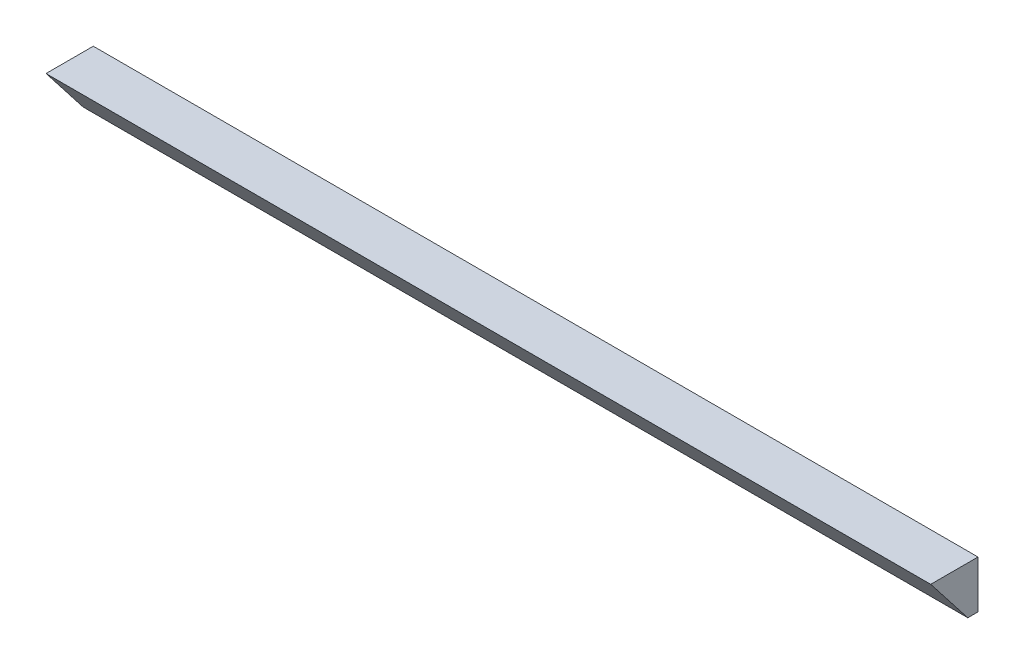
ISO-10303-21;
HEADER;
FILE_DESCRIPTION(('STEP AP214'),'2;1');
FILE_NAME('part.step','',(''),(''),'','','');
FILE_SCHEMA(('AUTOMOTIVE_DESIGN { 1 0 10303 214 1 1 1 1 }'));
ENDSEC;
DATA;
#1=APPLICATION_CONTEXT('core data for automotive mechanical design processes');
#2=APPLICATION_PROTOCOL_DEFINITION('international standard','automotive_design',2000,#1);
#3=PRODUCT_CONTEXT('',#1,'mechanical');
#4=PRODUCT('Part','Part','',(#3));
#5=PRODUCT_RELATED_PRODUCT_CATEGORY('part','',(#4));
#6=PRODUCT_DEFINITION_FORMATION('','',#4);
#7=PRODUCT_DEFINITION_CONTEXT('part definition',#1,'design');
#8=PRODUCT_DEFINITION('design','',#6,#7);
#9=PRODUCT_DEFINITION_SHAPE('','',#8);
#10=(LENGTH_UNIT() NAMED_UNIT(*) SI_UNIT(.MILLI.,.METRE.));
#11=(NAMED_UNIT(*) PLANE_ANGLE_UNIT() SI_UNIT($,.RADIAN.));
#12=(NAMED_UNIT(*) SI_UNIT($,.STERADIAN.) SOLID_ANGLE_UNIT());
#13=UNCERTAINTY_MEASURE_WITH_UNIT(LENGTH_MEASURE(1.E-05),#10,'distance_accuracy_value','');
#14=(GEOMETRIC_REPRESENTATION_CONTEXT(3) GLOBAL_UNCERTAINTY_ASSIGNED_CONTEXT((#13)) GLOBAL_UNIT_ASSIGNED_CONTEXT((#10,
#11,#12)) REPRESENTATION_CONTEXT('',''));
#15=CARTESIAN_POINT('',(0.,0.,0.));
#16=DIRECTION('',(0.,0.,1.));
#17=DIRECTION('',(1.,0.,0.));
#18=AXIS2_PLACEMENT_3D('',#15,#16,#17);
#19=CARTESIAN_POINT('',(-37.810925728328,-40.3644970414201,38.));
#20=DIRECTION('',(0.,1.,0.));
#21=DIRECTION('',(0.,0.,1.));
#22=AXIS2_PLACEMENT_3D('',#19,#20,#21);
#23=PLANE('',#22);
#24=DIRECTION('',(0.,0.,1.));
#25=VECTOR('',#24,1.);
#26=CARTESIAN_POINT('',(55.189074271672,-40.3644970414201,38.));
#27=LINE('',#26,#25);
#28=CARTESIAN_POINT('',(55.189074271672,-40.3644970414201,38.));
#29=VERTEX_POINT('',#28);
#30=CARTESIAN_POINT('',(55.189074271672,-40.3644970414201,39.0702920703453));
#31=VERTEX_POINT('',#30);
#32=EDGE_CURVE('E96',#29,#31,#27,.T.);
#33=ORIENTED_EDGE('',*,*,#32,.T.);
#34=DIRECTION('',(1.,0.,0.));
#35=VECTOR('',#34,1.);
#36=CARTESIAN_POINT('',(-37.810925728328,-40.3644970414201,39.0702920703453));
#37=LINE('',#36,#35);
#38=CARTESIAN_POINT('',(-37.810925728328,-40.3644970414201,39.0702920703453));
#39=VERTEX_POINT('',#38);
#40=EDGE_CURVE('E11',#39,#31,#37,.T.);
#41=ORIENTED_EDGE('',*,*,#40,.F.);
#42=DIRECTION('',(0.,0.,1.));
#43=VECTOR('',#42,1.);
#44=CARTESIAN_POINT('',(-37.810925728328,-40.3644970414201,38.));
#45=LINE('',#44,#43);
#46=CARTESIAN_POINT('',(-37.810925728328,-40.3644970414201,38.));
#47=VERTEX_POINT('',#46);
#48=EDGE_CURVE('E84',#47,#39,#45,.T.);
#49=ORIENTED_EDGE('',*,*,#48,.F.);
#50=DIRECTION('',(1.,0.,0.));
#51=VECTOR('',#50,1.);
#52=CARTESIAN_POINT('',(-37.810925728328,-40.3644970414201,38.));
#53=LINE('',#52,#51);
#54=EDGE_CURVE('E92',#47,#29,#53,.T.);
#55=ORIENTED_EDGE('',*,*,#54,.T.);
#56=EDGE_LOOP('',(#33,#41,#49,#55));
#57=FACE_BOUND('',#56,.T.);
#58=ADVANCED_FACE('F33',(#57),#23,.F.);
#59=CARTESIAN_POINT('',(-37.810925728328,-35.3644970414201,42.9711110868764));
#60=DIRECTION('',(0.,0.615112092088311,-0.788439670594232));
#61=DIRECTION('',(0.,0.788439670594232,0.615112092088311));
#62=AXIS2_PLACEMENT_3D('',#59,#60,#61);
#63=PLANE('',#62);
#64=DIRECTION('',(0.,0.788439670594232,0.615112092088311));
#65=VECTOR('',#64,1.);
#66=CARTESIAN_POINT('',(55.189074271672,-35.3644970414201,42.9711110868764));
#67=LINE('',#66,#65);
#68=CARTESIAN_POINT('',(55.189074271672,-35.3644970414201,42.9711110868764));
#69=VERTEX_POINT('',#68);
#70=EDGE_CURVE('E88',#31,#69,#67,.T.);
#71=ORIENTED_EDGE('',*,*,#70,.T.);
#72=DIRECTION('',(1.,0.,0.));
#73=VECTOR('',#72,1.);
#74=CARTESIAN_POINT('',(-37.810925728328,-35.3644970414201,42.9711110868764));
#75=LINE('',#74,#73);
#76=CARTESIAN_POINT('',(-37.810925728328,-35.3644970414201,42.9711110868764));
#77=VERTEX_POINT('',#76);
#78=EDGE_CURVE('E41',#77,#69,#75,.T.);
#79=ORIENTED_EDGE('',*,*,#78,.F.);
#80=DIRECTION('',(0.,0.788439670594232,0.615112092088311));
#81=VECTOR('',#80,1.);
#82=CARTESIAN_POINT('',(-37.810925728328,-35.3644970414201,42.9711110868764));
#83=LINE('',#82,#81);
#84=EDGE_CURVE('E79',#39,#77,#83,.T.);
#85=ORIENTED_EDGE('',*,*,#84,.F.);
#86=ORIENTED_EDGE('',*,*,#40,.T.);
#87=EDGE_LOOP('',(#71,#79,#85,#86));
#88=FACE_BOUND('',#87,.T.);
#89=ADVANCED_FACE('F87',(#88),#63,.F.);
#90=CARTESIAN_POINT('',(-37.810925728328,-35.3644970414201,38.));
#91=DIRECTION('',(0.,-1.,0.));
#92=DIRECTION('',(0.,0.,-1.));
#93=AXIS2_PLACEMENT_3D('',#90,#91,#92);
#94=PLANE('',#93);
#95=DIRECTION('',(0.,0.,-1.));
#96=VECTOR('',#95,1.);
#97=CARTESIAN_POINT('',(55.189074271672,-35.3644970414201,38.));
#98=LINE('',#97,#96);
#99=CARTESIAN_POINT('',(55.189074271672,-35.3644970414201,38.));
#100=VERTEX_POINT('',#99);
#101=EDGE_CURVE('E66',#69,#100,#98,.T.);
#102=ORIENTED_EDGE('',*,*,#101,.T.);
#103=DIRECTION('',(1.,0.,0.));
#104=VECTOR('',#103,1.);
#105=CARTESIAN_POINT('',(-37.810925728328,-35.3644970414201,38.));
#106=LINE('',#105,#104);
#107=CARTESIAN_POINT('',(-37.810925728328,-35.3644970414201,38.));
#108=VERTEX_POINT('',#107);
#109=EDGE_CURVE('E89',#108,#100,#106,.T.);
#110=ORIENTED_EDGE('',*,*,#109,.F.);
#111=DIRECTION('',(0.,0.,-1.));
#112=VECTOR('',#111,1.);
#113=CARTESIAN_POINT('',(-37.810925728328,-35.3644970414201,38.));
#114=LINE('',#113,#112);
#115=EDGE_CURVE('E82',#77,#108,#114,.T.);
#116=ORIENTED_EDGE('',*,*,#115,.F.);
#117=ORIENTED_EDGE('',*,*,#78,.T.);
#118=EDGE_LOOP('',(#102,#110,#116,#117));
#119=FACE_BOUND('',#118,.T.);
#120=ADVANCED_FACE('F90',(#119),#94,.F.);
#121=CARTESIAN_POINT('',(-37.810925728328,-40.3644970414201,38.));
#122=DIRECTION('',(0.,0.,1.));
#123=DIRECTION('',(0.,-1.,0.));
#124=AXIS2_PLACEMENT_3D('',#121,#122,#123);
#125=PLANE('',#124);
#126=DIRECTION('',(0.,-1.,0.));
#127=VECTOR('',#126,1.);
#128=CARTESIAN_POINT('',(55.189074271672,-40.3644970414201,38.));
#129=LINE('',#128,#127);
#130=EDGE_CURVE('E72',#100,#29,#129,.T.);
#131=ORIENTED_EDGE('',*,*,#130,.T.);
#132=ORIENTED_EDGE('',*,*,#54,.F.);
#133=DIRECTION('',(0.,-1.,0.));
#134=VECTOR('',#133,1.);
#135=CARTESIAN_POINT('',(-37.810925728328,-40.3644970414201,38.));
#136=LINE('',#135,#134);
#137=EDGE_CURVE('E49',#108,#47,#136,.T.);
#138=ORIENTED_EDGE('',*,*,#137,.F.);
#139=ORIENTED_EDGE('',*,*,#109,.T.);
#140=EDGE_LOOP('',(#131,#132,#138,#139));
#141=FACE_BOUND('',#140,.T.);
#142=ADVANCED_FACE('F103',(#141),#125,.F.);
#143=CARTESIAN_POINT('',(-37.810925728328,0.,0.));
#144=DIRECTION('',(-1.,0.,0.));
#145=DIRECTION('',(0.,0.,1.));
#146=AXIS2_PLACEMENT_3D('',#143,#144,#145);
#147=PLANE('',#146);
#148=ORIENTED_EDGE('',*,*,#48,.T.);
#149=ORIENTED_EDGE('',*,*,#84,.T.);
#150=ORIENTED_EDGE('',*,*,#115,.T.);
#151=ORIENTED_EDGE('',*,*,#137,.T.);
#152=EDGE_LOOP('',(#148,#149,#150,#151));
#153=FACE_BOUND('',#152,.T.);
#154=ADVANCED_FACE('F80',(#153),#147,.T.);
#155=CARTESIAN_POINT('',(55.189074271672,0.,0.));
#156=DIRECTION('',(-1.,0.,0.));
#157=DIRECTION('',(0.,0.,1.));
#158=AXIS2_PLACEMENT_3D('',#155,#156,#157);
#159=PLANE('',#158);
#160=ORIENTED_EDGE('',*,*,#32,.F.);
#161=ORIENTED_EDGE('',*,*,#130,.F.);
#162=ORIENTED_EDGE('',*,*,#101,.F.);
#163=ORIENTED_EDGE('',*,*,#70,.F.);
#164=EDGE_LOOP('',(#160,#161,#162,#163));
#165=FACE_BOUND('',#164,.T.);
#166=ADVANCED_FACE('F106',(#165),#159,.F.);
#167=CLOSED_SHELL('',(#58,#89,#120,#142,#154,#166));
#168=MANIFOLD_SOLID_BREP('B2',#167);
#169=ADVANCED_BREP_SHAPE_REPRESENTATION('',(#18,#168),#14);
#170=SHAPE_DEFINITION_REPRESENTATION(#9,#169);
ENDSEC;
END-ISO-10303-21;
